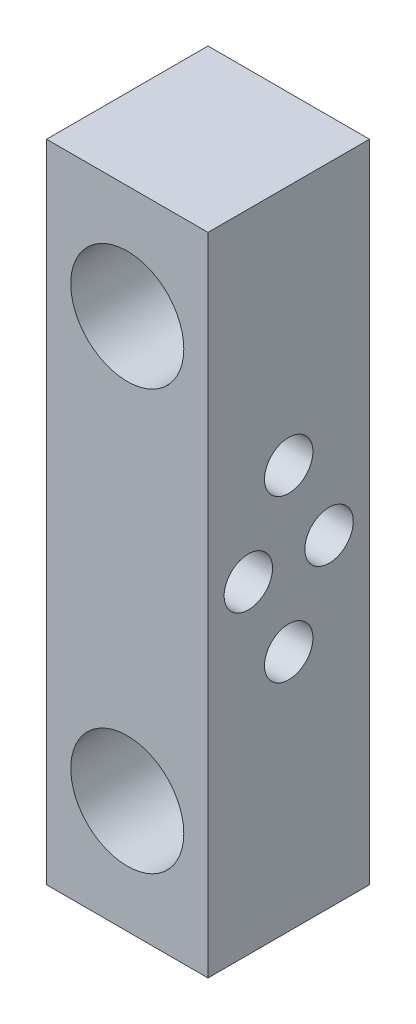
ISO-10303-21;
HEADER;
FILE_DESCRIPTION(('STEP AP214'),'2;1');
FILE_NAME('part.step','',(''),(''),'','','');
FILE_SCHEMA(('AUTOMOTIVE_DESIGN { 1 0 10303 214 1 1 1 1 }'));
ENDSEC;
DATA;
#1=APPLICATION_CONTEXT('core data for automotive mechanical design processes');
#2=APPLICATION_PROTOCOL_DEFINITION('international standard','automotive_design',2000,#1);
#3=PRODUCT_CONTEXT('',#1,'mechanical');
#4=PRODUCT('Part','Part','',(#3));
#5=PRODUCT_RELATED_PRODUCT_CATEGORY('part','',(#4));
#6=PRODUCT_DEFINITION_FORMATION('','',#4);
#7=PRODUCT_DEFINITION_CONTEXT('part definition',#1,'design');
#8=PRODUCT_DEFINITION('design','',#6,#7);
#9=PRODUCT_DEFINITION_SHAPE('','',#8);
#10=(LENGTH_UNIT() NAMED_UNIT(*) SI_UNIT(.MILLI.,.METRE.));
#11=(NAMED_UNIT(*) PLANE_ANGLE_UNIT() SI_UNIT($,.RADIAN.));
#12=(NAMED_UNIT(*) SI_UNIT($,.STERADIAN.) SOLID_ANGLE_UNIT());
#13=UNCERTAINTY_MEASURE_WITH_UNIT(LENGTH_MEASURE(1.E-05),#10,'distance_accuracy_value','');
#14=(GEOMETRIC_REPRESENTATION_CONTEXT(3) GLOBAL_UNCERTAINTY_ASSIGNED_CONTEXT((#13)) GLOBAL_UNIT_ASSIGNED_CONTEXT((#10,
#11,#12)) REPRESENTATION_CONTEXT('',''));
#15=CARTESIAN_POINT('',(0.,0.,0.));
#16=DIRECTION('',(0.,0.,1.));
#17=DIRECTION('',(1.,0.,0.));
#18=AXIS2_PLACEMENT_3D('',#15,#16,#17);
#19=CARTESIAN_POINT('',(0.,0.,10.));
#20=DIRECTION('',(0.,0.,1.));
#21=DIRECTION('',(1.,0.,0.));
#22=AXIS2_PLACEMENT_3D('',#19,#20,#21);
#23=PLANE('',#22);
#24=CARTESIAN_POINT('',(0.,13.,10.));
#25=DIRECTION('',(0.,0.,1.));
#26=DIRECTION('',(1.,0.,0.));
#27=AXIS2_PLACEMENT_3D('',#24,#25,#26);
#28=CIRCLE('',#27,3.5);
#29=CARTESIAN_POINT('',(3.5,13.,10.));
#30=VERTEX_POINT('',#29);
#31=EDGE_CURVE('E112',#30,#30,#28,.T.);
#32=ORIENTED_EDGE('',*,*,#31,.F.);
#33=EDGE_LOOP('',(#32));
#34=FACE_BOUND('',#33,.T.);
#35=DIRECTION('',(0.,1.,0.));
#36=VECTOR('',#35,1.);
#37=CARTESIAN_POINT('',(5.,20.,10.));
#38=LINE('',#37,#36);
#39=CARTESIAN_POINT('',(5.,-20.,10.));
#40=VERTEX_POINT('',#39);
#41=CARTESIAN_POINT('',(5.,20.,10.));
#42=VERTEX_POINT('',#41);
#43=EDGE_CURVE('E92',#40,#42,#38,.T.);
#44=ORIENTED_EDGE('',*,*,#43,.T.);
#45=DIRECTION('',(-1.,0.,0.));
#46=VECTOR('',#45,1.);
#47=CARTESIAN_POINT('',(-5.,20.,10.));
#48=LINE('',#47,#46);
#49=CARTESIAN_POINT('',(-5.,20.,10.));
#50=VERTEX_POINT('',#49);
#51=EDGE_CURVE('E87',#42,#50,#48,.T.);
#52=ORIENTED_EDGE('',*,*,#51,.T.);
#53=DIRECTION('',(0.,-1.,0.));
#54=VECTOR('',#53,1.);
#55=CARTESIAN_POINT('',(-5.,20.,10.));
#56=LINE('',#55,#54);
#57=CARTESIAN_POINT('',(-5.,-20.,10.));
#58=VERTEX_POINT('',#57);
#59=EDGE_CURVE('E90',#50,#58,#56,.T.);
#60=ORIENTED_EDGE('',*,*,#59,.T.);
#61=DIRECTION('',(1.,0.,0.));
#62=VECTOR('',#61,1.);
#63=CARTESIAN_POINT('',(-5.,-20.,10.));
#64=LINE('',#63,#62);
#65=EDGE_CURVE('E57',#58,#40,#64,.T.);
#66=ORIENTED_EDGE('',*,*,#65,.T.);
#67=EDGE_LOOP('',(#44,#52,#60,#66));
#68=FACE_BOUND('',#67,.T.);
#69=CARTESIAN_POINT('',(0.,-13.,10.));
#70=DIRECTION('',(0.,0.,1.));
#71=DIRECTION('',(1.,0.,0.));
#72=AXIS2_PLACEMENT_3D('',#69,#70,#71);
#73=CIRCLE('',#72,3.5);
#74=CARTESIAN_POINT('',(3.5,-13.,10.));
#75=VERTEX_POINT('',#74);
#76=EDGE_CURVE('E134',#75,#75,#73,.T.);
#77=ORIENTED_EDGE('',*,*,#76,.F.);
#78=EDGE_LOOP('',(#77));
#79=FACE_BOUND('',#78,.T.);
#80=ADVANCED_FACE('F39',(#34,#68,#79),#23,.T.);
#81=CARTESIAN_POINT('',(0.,0.,0.));
#82=DIRECTION('',(0.,0.,1.));
#83=DIRECTION('',(1.,0.,0.));
#84=AXIS2_PLACEMENT_3D('',#81,#82,#83);
#85=PLANE('',#84);
#86=DIRECTION('',(0.,1.,0.));
#87=VECTOR('',#86,1.);
#88=CARTESIAN_POINT('',(5.,20.,0.));
#89=LINE('',#88,#87);
#90=CARTESIAN_POINT('',(5.,-20.,0.));
#91=VERTEX_POINT('',#90);
#92=CARTESIAN_POINT('',(5.,20.,0.));
#93=VERTEX_POINT('',#92);
#94=EDGE_CURVE('E108',#91,#93,#89,.T.);
#95=ORIENTED_EDGE('',*,*,#94,.F.);
#96=DIRECTION('',(1.,0.,0.));
#97=VECTOR('',#96,1.);
#98=CARTESIAN_POINT('',(-5.,-20.,0.));
#99=LINE('',#98,#97);
#100=CARTESIAN_POINT('',(-5.,-20.,0.));
#101=VERTEX_POINT('',#100);
#102=EDGE_CURVE('E80',#101,#91,#99,.T.);
#103=ORIENTED_EDGE('',*,*,#102,.F.);
#104=DIRECTION('',(0.,-1.,0.));
#105=VECTOR('',#104,1.);
#106=CARTESIAN_POINT('',(-5.,20.,0.));
#107=LINE('',#106,#105);
#108=CARTESIAN_POINT('',(-5.,20.,0.));
#109=VERTEX_POINT('',#108);
#110=EDGE_CURVE('E74',#109,#101,#107,.T.);
#111=ORIENTED_EDGE('',*,*,#110,.F.);
#112=DIRECTION('',(-1.,0.,0.));
#113=VECTOR('',#112,1.);
#114=CARTESIAN_POINT('',(-5.,20.,0.));
#115=LINE('',#114,#113);
#116=EDGE_CURVE('E97',#93,#109,#115,.T.);
#117=ORIENTED_EDGE('',*,*,#116,.F.);
#118=EDGE_LOOP('',(#95,#103,#111,#117));
#119=FACE_BOUND('',#118,.T.);
#120=CARTESIAN_POINT('',(0.,13.,0.));
#121=DIRECTION('',(0.,0.,1.));
#122=DIRECTION('',(1.,0.,0.));
#123=AXIS2_PLACEMENT_3D('',#120,#121,#122);
#124=CIRCLE('',#123,3.5);
#125=CARTESIAN_POINT('',(3.5,13.,0.));
#126=VERTEX_POINT('',#125);
#127=EDGE_CURVE('E130',#126,#126,#124,.T.);
#128=ORIENTED_EDGE('',*,*,#127,.T.);
#129=EDGE_LOOP('',(#128));
#130=FACE_BOUND('',#129,.T.);
#131=CARTESIAN_POINT('',(0.,-13.,0.));
#132=DIRECTION('',(0.,0.,1.));
#133=DIRECTION('',(1.,0.,0.));
#134=AXIS2_PLACEMENT_3D('',#131,#132,#133);
#135=CIRCLE('',#134,3.5);
#136=CARTESIAN_POINT('',(3.5,-13.,0.));
#137=VERTEX_POINT('',#136);
#138=EDGE_CURVE('E138',#137,#137,#135,.T.);
#139=ORIENTED_EDGE('',*,*,#138,.T.);
#140=EDGE_LOOP('',(#139));
#141=FACE_BOUND('',#140,.T.);
#142=ADVANCED_FACE('F125',(#119,#130,#141),#85,.F.);
#143=CARTESIAN_POINT('',(5.,20.,10.));
#144=DIRECTION('',(-1.,0.,0.));
#145=DIRECTION('',(0.,-1.,0.));
#146=AXIS2_PLACEMENT_3D('',#143,#144,#145);
#147=PLANE('',#146);
#148=CARTESIAN_POINT('',(5.,5.,5.));
#149=DIRECTION('',(1.,0.,0.));
#150=DIRECTION('',(0.,1.,0.));
#151=AXIS2_PLACEMENT_3D('',#148,#149,#150);
#152=CIRCLE('',#151,1.5);
#153=CARTESIAN_POINT('',(5.,6.5,5.));
#154=VERTEX_POINT('',#153);
#155=EDGE_CURVE('E163',#154,#154,#152,.T.);
#156=ORIENTED_EDGE('',*,*,#155,.F.);
#157=EDGE_LOOP('',(#156));
#158=FACE_BOUND('',#157,.T.);
#159=CARTESIAN_POINT('',(5.,0.,7.5));
#160=DIRECTION('',(1.,0.,0.));
#161=DIRECTION('',(0.,1.,0.));
#162=AXIS2_PLACEMENT_3D('',#159,#160,#161);
#163=CIRCLE('',#162,1.5);
#164=CARTESIAN_POINT('',(5.,1.5,7.5));
#165=VERTEX_POINT('',#164);
#166=EDGE_CURVE('E164',#165,#165,#163,.T.);
#167=ORIENTED_EDGE('',*,*,#166,.F.);
#168=EDGE_LOOP('',(#167));
#169=FACE_BOUND('',#168,.T.);
#170=CARTESIAN_POINT('',(5.,0.,2.5));
#171=DIRECTION('',(1.,0.,0.));
#172=DIRECTION('',(0.,1.,0.));
#173=AXIS2_PLACEMENT_3D('',#170,#171,#172);
#174=CIRCLE('',#173,1.5);
#175=CARTESIAN_POINT('',(5.,1.5,2.5));
#176=VERTEX_POINT('',#175);
#177=EDGE_CURVE('E146',#176,#176,#174,.T.);
#178=ORIENTED_EDGE('',*,*,#177,.F.);
#179=EDGE_LOOP('',(#178));
#180=FACE_BOUND('',#179,.T.);
#181=CARTESIAN_POINT('',(5.,-5.,5.));
#182=DIRECTION('',(1.,0.,0.));
#183=DIRECTION('',(0.,1.,0.));
#184=AXIS2_PLACEMENT_3D('',#181,#182,#183);
#185=CIRCLE('',#184,1.5);
#186=CARTESIAN_POINT('',(5.,-3.5,5.));
#187=VERTEX_POINT('',#186);
#188=EDGE_CURVE('E155',#187,#187,#185,.T.);
#189=ORIENTED_EDGE('',*,*,#188,.F.);
#190=EDGE_LOOP('',(#189));
#191=FACE_BOUND('',#190,.T.);
#192=ORIENTED_EDGE('',*,*,#94,.T.);
#193=DIRECTION('',(0.,0.,-1.));
#194=VECTOR('',#193,1.);
#195=CARTESIAN_POINT('',(5.,20.,10.));
#196=LINE('',#195,#194);
#197=EDGE_CURVE('E11',#42,#93,#196,.T.);
#198=ORIENTED_EDGE('',*,*,#197,.F.);
#199=ORIENTED_EDGE('',*,*,#43,.F.);
#200=DIRECTION('',(0.,0.,-1.));
#201=VECTOR('',#200,1.);
#202=CARTESIAN_POINT('',(5.,-20.,10.));
#203=LINE('',#202,#201);
#204=EDGE_CURVE('E104',#40,#91,#203,.T.);
#205=ORIENTED_EDGE('',*,*,#204,.T.);
#206=EDGE_LOOP('',(#192,#198,#199,#205));
#207=FACE_BOUND('',#206,.T.);
#208=ADVANCED_FACE('F41',(#158,#169,#180,#191,#207),#147,.F.);
#209=CARTESIAN_POINT('',(-5.,20.,10.));
#210=DIRECTION('',(0.,-1.,0.));
#211=DIRECTION('',(0.,0.,-1.));
#212=AXIS2_PLACEMENT_3D('',#209,#210,#211);
#213=PLANE('',#212);
#214=ORIENTED_EDGE('',*,*,#116,.T.);
#215=DIRECTION('',(0.,0.,-1.));
#216=VECTOR('',#215,1.);
#217=CARTESIAN_POINT('',(-5.,20.,10.));
#218=LINE('',#217,#216);
#219=EDGE_CURVE('E49',#50,#109,#218,.T.);
#220=ORIENTED_EDGE('',*,*,#219,.F.);
#221=ORIENTED_EDGE('',*,*,#51,.F.);
#222=ORIENTED_EDGE('',*,*,#197,.T.);
#223=EDGE_LOOP('',(#214,#220,#221,#222));
#224=FACE_BOUND('',#223,.T.);
#225=ADVANCED_FACE('F96',(#224),#213,.F.);
#226=CARTESIAN_POINT('',(-5.,20.,10.));
#227=DIRECTION('',(1.,0.,0.));
#228=DIRECTION('',(0.,1.,0.));
#229=AXIS2_PLACEMENT_3D('',#226,#227,#228);
#230=PLANE('',#229);
#231=CARTESIAN_POINT('',(-5.00000000000001,5.,5.));
#232=DIRECTION('',(1.,0.,0.));
#233=DIRECTION('',(0.,1.,0.));
#234=AXIS2_PLACEMENT_3D('',#231,#232,#233);
#235=CIRCLE('',#234,1.5);
#236=CARTESIAN_POINT('',(-5.00000000000001,6.5,5.));
#237=VERTEX_POINT('',#236);
#238=EDGE_CURVE('E142',#237,#237,#235,.T.);
#239=ORIENTED_EDGE('',*,*,#238,.T.);
#240=EDGE_LOOP('',(#239));
#241=FACE_BOUND('',#240,.T.);
#242=CARTESIAN_POINT('',(-5.00000000000001,0.,7.5));
#243=DIRECTION('',(1.,0.,0.));
#244=DIRECTION('',(0.,1.,0.));
#245=AXIS2_PLACEMENT_3D('',#242,#243,#244);
#246=CIRCLE('',#245,1.5);
#247=CARTESIAN_POINT('',(-5.00000000000001,1.5,7.5));
#248=VERTEX_POINT('',#247);
#249=EDGE_CURVE('E151',#248,#248,#246,.T.);
#250=ORIENTED_EDGE('',*,*,#249,.T.);
#251=EDGE_LOOP('',(#250));
#252=FACE_BOUND('',#251,.T.);
#253=CARTESIAN_POINT('',(-5.00000000000001,0.,2.5));
#254=DIRECTION('',(1.,0.,0.));
#255=DIRECTION('',(0.,1.,0.));
#256=AXIS2_PLACEMENT_3D('',#253,#254,#255);
#257=CIRCLE('',#256,1.5);
#258=CARTESIAN_POINT('',(-5.00000000000001,1.5,2.5));
#259=VERTEX_POINT('',#258);
#260=EDGE_CURVE('E150',#259,#259,#257,.T.);
#261=ORIENTED_EDGE('',*,*,#260,.T.);
#262=EDGE_LOOP('',(#261));
#263=FACE_BOUND('',#262,.T.);
#264=CARTESIAN_POINT('',(-5.00000000000001,-5.,5.));
#265=DIRECTION('',(1.,0.,0.));
#266=DIRECTION('',(0.,1.,0.));
#267=AXIS2_PLACEMENT_3D('',#264,#265,#266);
#268=CIRCLE('',#267,1.5);
#269=CARTESIAN_POINT('',(-5.00000000000001,-3.5,5.));
#270=VERTEX_POINT('',#269);
#271=EDGE_CURVE('E159',#270,#270,#268,.T.);
#272=ORIENTED_EDGE('',*,*,#271,.T.);
#273=EDGE_LOOP('',(#272));
#274=FACE_BOUND('',#273,.T.);
#275=ORIENTED_EDGE('',*,*,#110,.T.);
#276=DIRECTION('',(0.,0.,-1.));
#277=VECTOR('',#276,1.);
#278=CARTESIAN_POINT('',(-5.,-20.,10.));
#279=LINE('',#278,#277);
#280=EDGE_CURVE('E99',#58,#101,#279,.T.);
#281=ORIENTED_EDGE('',*,*,#280,.F.);
#282=ORIENTED_EDGE('',*,*,#59,.F.);
#283=ORIENTED_EDGE('',*,*,#219,.T.);
#284=EDGE_LOOP('',(#275,#281,#282,#283));
#285=FACE_BOUND('',#284,.T.);
#286=ADVANCED_FACE('F100',(#241,#252,#263,#274,#285),#230,.F.);
#287=CARTESIAN_POINT('',(-5.,-20.,10.));
#288=DIRECTION('',(0.,1.,0.));
#289=DIRECTION('',(0.,0.,1.));
#290=AXIS2_PLACEMENT_3D('',#287,#288,#289);
#291=PLANE('',#290);
#292=ORIENTED_EDGE('',*,*,#102,.T.);
#293=ORIENTED_EDGE('',*,*,#204,.F.);
#294=ORIENTED_EDGE('',*,*,#65,.F.);
#295=ORIENTED_EDGE('',*,*,#280,.T.);
#296=EDGE_LOOP('',(#292,#293,#294,#295));
#297=FACE_BOUND('',#296,.T.);
#298=ADVANCED_FACE('F122',(#297),#291,.F.);
#299=CARTESIAN_POINT('',(0.,13.,10.));
#300=DIRECTION('',(0.,0.,-1.));
#301=DIRECTION('',(-1.,0.,0.));
#302=AXIS2_PLACEMENT_3D('',#299,#300,#301);
#303=CYLINDRICAL_SURFACE('',#302,3.5);
#304=ORIENTED_EDGE('',*,*,#31,.T.);
#305=EDGE_LOOP('',(#304));
#306=FACE_BOUND('',#305,.T.);
#307=ORIENTED_EDGE('',*,*,#127,.F.);
#308=EDGE_LOOP('',(#307));
#309=FACE_BOUND('',#308,.T.);
#310=ADVANCED_FACE('F207',(#306,#309),#303,.F.);
#311=CARTESIAN_POINT('',(0.,-13.,10.));
#312=DIRECTION('',(0.,0.,-1.));
#313=DIRECTION('',(-1.,0.,0.));
#314=AXIS2_PLACEMENT_3D('',#311,#312,#313);
#315=CYLINDRICAL_SURFACE('',#314,3.5);
#316=ORIENTED_EDGE('',*,*,#76,.T.);
#317=EDGE_LOOP('',(#316));
#318=FACE_BOUND('',#317,.T.);
#319=ORIENTED_EDGE('',*,*,#138,.F.);
#320=EDGE_LOOP('',(#319));
#321=FACE_BOUND('',#320,.T.);
#322=ADVANCED_FACE('F198',(#318,#321),#315,.F.);
#323=CARTESIAN_POINT('',(-5.00000000000001,-5.,5.));
#324=DIRECTION('',(1.,0.,0.));
#325=DIRECTION('',(0.,1.,0.));
#326=AXIS2_PLACEMENT_3D('',#323,#324,#325);
#327=CYLINDRICAL_SURFACE('',#326,1.5);
#328=ORIENTED_EDGE('',*,*,#271,.F.);
#329=EDGE_LOOP('',(#328));
#330=FACE_BOUND('',#329,.T.);
#331=ORIENTED_EDGE('',*,*,#188,.T.);
#332=EDGE_LOOP('',(#331));
#333=FACE_BOUND('',#332,.T.);
#334=ADVANCED_FACE('F195',(#330,#333),#327,.F.);
#335=CARTESIAN_POINT('',(-5.00000000000001,0.,2.5));
#336=DIRECTION('',(1.,0.,0.));
#337=DIRECTION('',(0.,1.,0.));
#338=AXIS2_PLACEMENT_3D('',#335,#336,#337);
#339=CYLINDRICAL_SURFACE('',#338,1.5);
#340=ORIENTED_EDGE('',*,*,#260,.F.);
#341=EDGE_LOOP('',(#340));
#342=FACE_BOUND('',#341,.T.);
#343=ORIENTED_EDGE('',*,*,#177,.T.);
#344=EDGE_LOOP('',(#343));
#345=FACE_BOUND('',#344,.T.);
#346=ADVANCED_FACE('F197',(#342,#345),#339,.F.);
#347=CARTESIAN_POINT('',(-5.00000000000001,0.,7.5));
#348=DIRECTION('',(1.,0.,0.));
#349=DIRECTION('',(0.,1.,0.));
#350=AXIS2_PLACEMENT_3D('',#347,#348,#349);
#351=CYLINDRICAL_SURFACE('',#350,1.5);
#352=ORIENTED_EDGE('',*,*,#249,.F.);
#353=EDGE_LOOP('',(#352));
#354=FACE_BOUND('',#353,.T.);
#355=ORIENTED_EDGE('',*,*,#166,.T.);
#356=EDGE_LOOP('',(#355));
#357=FACE_BOUND('',#356,.T.);
#358=ADVANCED_FACE('F183',(#354,#357),#351,.F.);
#359=CARTESIAN_POINT('',(-5.00000000000001,5.,5.));
#360=DIRECTION('',(1.,0.,0.));
#361=DIRECTION('',(0.,1.,0.));
#362=AXIS2_PLACEMENT_3D('',#359,#360,#361);
#363=CYLINDRICAL_SURFACE('',#362,1.5);
#364=ORIENTED_EDGE('',*,*,#238,.F.);
#365=EDGE_LOOP('',(#364));
#366=FACE_BOUND('',#365,.T.);
#367=ORIENTED_EDGE('',*,*,#155,.T.);
#368=EDGE_LOOP('',(#367));
#369=FACE_BOUND('',#368,.T.);
#370=ADVANCED_FACE('F180',(#366,#369),#363,.F.);
#371=CLOSED_SHELL('',(#80,#142,#208,#225,#286,#298,#310,#322,#334,#346,#358,#370));
#372=MANIFOLD_SOLID_BREP('B2',#371);
#373=ADVANCED_BREP_SHAPE_REPRESENTATION('',(#18,#372),#14);
#374=SHAPE_DEFINITION_REPRESENTATION(#9,#373);
ENDSEC;
END-ISO-10303-21;
